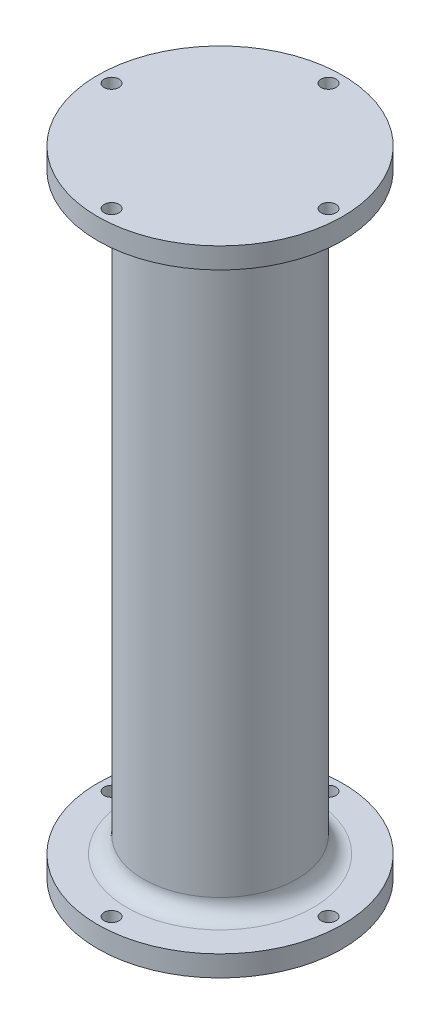
ISO-10303-21;
HEADER;
FILE_DESCRIPTION(('STEP AP214'),'2;1');
FILE_NAME('part.step','',(''),(''),'','','');
FILE_SCHEMA(('AUTOMOTIVE_DESIGN { 1 0 10303 214 1 1 1 1 }'));
ENDSEC;
DATA;
#1=APPLICATION_CONTEXT('core data for automotive mechanical design processes');
#2=APPLICATION_PROTOCOL_DEFINITION('international standard','automotive_design',2000,#1);
#3=PRODUCT_CONTEXT('',#1,'mechanical');
#4=PRODUCT('Part','Part','',(#3));
#5=PRODUCT_RELATED_PRODUCT_CATEGORY('part','',(#4));
#6=PRODUCT_DEFINITION_FORMATION('','',#4);
#7=PRODUCT_DEFINITION_CONTEXT('part definition',#1,'design');
#8=PRODUCT_DEFINITION('design','',#6,#7);
#9=PRODUCT_DEFINITION_SHAPE('','',#8);
#10=(LENGTH_UNIT() NAMED_UNIT(*) SI_UNIT(.MILLI.,.METRE.));
#11=(NAMED_UNIT(*) PLANE_ANGLE_UNIT() SI_UNIT($,.RADIAN.));
#12=(NAMED_UNIT(*) SI_UNIT($,.STERADIAN.) SOLID_ANGLE_UNIT());
#13=UNCERTAINTY_MEASURE_WITH_UNIT(LENGTH_MEASURE(1.E-05),#10,'distance_accuracy_value','');
#14=(GEOMETRIC_REPRESENTATION_CONTEXT(3) GLOBAL_UNCERTAINTY_ASSIGNED_CONTEXT((#13)) GLOBAL_UNIT_ASSIGNED_CONTEXT((#10,
#11,#12)) REPRESENTATION_CONTEXT('',''));
#15=CARTESIAN_POINT('',(0.,0.,0.));
#16=DIRECTION('',(0.,0.,1.));
#17=DIRECTION('',(1.,0.,0.));
#18=AXIS2_PLACEMENT_3D('',#15,#16,#17);
#19=CARTESIAN_POINT('',(0.,385.699,0.));
#20=DIRECTION('',(0.,-1.,0.));
#21=DIRECTION('',(0.,0.,-1.));
#22=AXIS2_PLACEMENT_3D('',#19,#20,#21);
#23=CYLINDRICAL_SURFACE('',#22,74.5);
#24=CARTESIAN_POINT('',(0.,12.7,0.));
#25=DIRECTION('',(0.,1.,0.));
#26=DIRECTION('',(0.,0.,1.));
#27=AXIS2_PLACEMENT_3D('',#24,#25,#26);
#28=CIRCLE('',#27,74.5);
#29=CARTESIAN_POINT('',(0.,12.7,74.5));
#30=VERTEX_POINT('',#29);
#31=EDGE_CURVE('E74',#30,#30,#28,.T.);
#32=ORIENTED_EDGE('',*,*,#31,.F.);
#33=EDGE_LOOP('',(#32));
#34=FACE_BOUND('',#33,.T.);
#35=CARTESIAN_POINT('',(0.,0.,0.));
#36=DIRECTION('',(0.,1.,0.));
#37=DIRECTION('',(0.,0.,1.));
#38=AXIS2_PLACEMENT_3D('',#35,#36,#37);
#39=CIRCLE('',#38,74.5);
#40=CARTESIAN_POINT('',(0.,0.,74.5));
#41=VERTEX_POINT('',#40);
#42=EDGE_CURVE('E70',#41,#41,#39,.T.);
#43=ORIENTED_EDGE('',*,*,#42,.T.);
#44=EDGE_LOOP('',(#43));
#45=FACE_BOUND('',#44,.T.);
#46=ADVANCED_FACE('F45',(#34,#45),#23,.T.);
#47=CARTESIAN_POINT('',(0.,0.,0.));
#48=DIRECTION('',(0.,1.,0.));
#49=DIRECTION('',(0.,0.,1.));
#50=AXIS2_PLACEMENT_3D('',#47,#48,#49);
#51=PLANE('',#50);
#52=CARTESIAN_POINT('',(66.000122,0.,-2.3043819432437E-13));
#53=DIRECTION('',(0.,-1.,0.));
#54=DIRECTION('',(-1.,0.,0.));
#55=AXIS2_PLACEMENT_3D('',#52,#53,#54);
#56=CIRCLE('',#55,4.499991);
#57=CARTESIAN_POINT('',(61.500131,0.,-2.14726559722908E-13));
#58=VERTEX_POINT('',#57);
#59=EDGE_CURVE('E142',#58,#58,#56,.T.);
#60=ORIENTED_EDGE('',*,*,#59,.F.);
#61=EDGE_LOOP('',(#60));
#62=FACE_BOUND('',#61,.T.);
#63=CARTESIAN_POINT('',(0.,0.,-66.000122));
#64=DIRECTION('',(0.,-1.,0.));
#65=DIRECTION('',(0.,0.,1.));
#66=AXIS2_PLACEMENT_3D('',#63,#64,#65);
#67=CIRCLE('',#66,4.499991);
#68=CARTESIAN_POINT('',(0.,0.,-61.500131));
#69=VERTEX_POINT('',#68);
#70=EDGE_CURVE('E134',#69,#69,#67,.T.);
#71=ORIENTED_EDGE('',*,*,#70,.F.);
#72=EDGE_LOOP('',(#71));
#73=FACE_BOUND('',#72,.T.);
#74=CARTESIAN_POINT('',(-66.000122,0.,6.9131458297311E-13));
#75=DIRECTION('',(0.,-1.,0.));
#76=DIRECTION('',(1.,0.,0.));
#77=AXIS2_PLACEMENT_3D('',#74,#75,#76);
#78=CIRCLE('',#77,4.499991);
#79=CARTESIAN_POINT('',(-61.500131,0.,6.44179679168724E-13));
#80=VERTEX_POINT('',#79);
#81=EDGE_CURVE('E126',#80,#80,#78,.T.);
#82=ORIENTED_EDGE('',*,*,#81,.F.);
#83=EDGE_LOOP('',(#82));
#84=FACE_BOUND('',#83,.T.);
#85=CARTESIAN_POINT('',(0.,0.,66.000122));
#86=DIRECTION('',(0.,-1.,0.));
#87=DIRECTION('',(0.,0.,-1.));
#88=AXIS2_PLACEMENT_3D('',#85,#86,#87);
#89=CIRCLE('',#88,4.499991);
#90=CARTESIAN_POINT('',(0.,0.,61.500131));
#91=VERTEX_POINT('',#90);
#92=EDGE_CURVE('E94',#91,#91,#89,.T.);
#93=ORIENTED_EDGE('',*,*,#92,.F.);
#94=EDGE_LOOP('',(#93));
#95=FACE_BOUND('',#94,.T.);
#96=ORIENTED_EDGE('',*,*,#42,.F.);
#97=EDGE_LOOP('',(#96));
#98=FACE_BOUND('',#97,.T.);
#99=ADVANCED_FACE('F195',(#62,#73,#84,#95,#98),#51,.F.);
#100=CARTESIAN_POINT('',(-74.5,12.7,0.));
#101=DIRECTION('',(0.,-1.,0.));
#102=DIRECTION('',(0.,0.,-1.));
#103=AXIS2_PLACEMENT_3D('',#100,#101,#102);
#104=PLANE('',#103);
#105=CARTESIAN_POINT('',(0.,12.7,0.));
#106=DIRECTION('',(0.,-1.,0.));
#107=DIRECTION('',(0.,0.,-1.));
#108=AXIS2_PLACEMENT_3D('',#105,#106,#107);
#109=CIRCLE('',#108,56.6422122002477);
#110=CARTESIAN_POINT('',(0.,12.7,-56.6422122002477));
#111=VERTEX_POINT('',#110);
#112=EDGE_CURVE('E53',#111,#111,#109,.T.);
#113=ORIENTED_EDGE('',*,*,#112,.T.);
#114=EDGE_LOOP('',(#113));
#115=FACE_BOUND('',#114,.T.);
#116=CARTESIAN_POINT('',(66.000122,12.7,-2.3043819432437E-13));
#117=DIRECTION('',(0.,-1.,0.));
#118=DIRECTION('',(0.,0.,-1.));
#119=AXIS2_PLACEMENT_3D('',#116,#117,#118);
#120=CIRCLE('',#119,4.499991);
#121=CARTESIAN_POINT('',(66.000122,12.7,-4.49999100000023));
#122=VERTEX_POINT('',#121);
#123=EDGE_CURVE('E98',#122,#122,#120,.T.);
#124=ORIENTED_EDGE('',*,*,#123,.T.);
#125=EDGE_LOOP('',(#124));
#126=FACE_BOUND('',#125,.T.);
#127=CARTESIAN_POINT('',(0.,12.7,-66.000122));
#128=DIRECTION('',(0.,-1.,0.));
#129=DIRECTION('',(0.,0.,-1.));
#130=AXIS2_PLACEMENT_3D('',#127,#128,#129);
#131=CIRCLE('',#130,4.499991);
#132=CARTESIAN_POINT('',(0.,12.7,-70.500113));
#133=VERTEX_POINT('',#132);
#134=EDGE_CURVE('E109',#133,#133,#131,.T.);
#135=ORIENTED_EDGE('',*,*,#134,.T.);
#136=EDGE_LOOP('',(#135));
#137=FACE_BOUND('',#136,.T.);
#138=CARTESIAN_POINT('',(-66.000122,12.7,6.9131458297311E-13));
#139=DIRECTION('',(0.,-1.,0.));
#140=DIRECTION('',(0.,0.,-1.));
#141=AXIS2_PLACEMENT_3D('',#138,#139,#140);
#142=CIRCLE('',#141,4.499991);
#143=CARTESIAN_POINT('',(-66.000122,12.7,-4.49999099999931));
#144=VERTEX_POINT('',#143);
#145=EDGE_CURVE('E117',#144,#144,#142,.T.);
#146=ORIENTED_EDGE('',*,*,#145,.T.);
#147=EDGE_LOOP('',(#146));
#148=FACE_BOUND('',#147,.T.);
#149=CARTESIAN_POINT('',(0.,12.7,66.000122));
#150=DIRECTION('',(0.,-1.,0.));
#151=DIRECTION('',(0.,0.,-1.));
#152=AXIS2_PLACEMENT_3D('',#149,#150,#151);
#153=CIRCLE('',#152,4.499991);
#154=CARTESIAN_POINT('',(0.,12.7,61.500131));
#155=VERTEX_POINT('',#154);
#156=EDGE_CURVE('E85',#155,#155,#153,.T.);
#157=ORIENTED_EDGE('',*,*,#156,.T.);
#158=EDGE_LOOP('',(#157));
#159=FACE_BOUND('',#158,.T.);
#160=ORIENTED_EDGE('',*,*,#31,.T.);
#161=EDGE_LOOP('',(#160));
#162=FACE_BOUND('',#161,.T.);
#163=ADVANCED_FACE('F166',(#115,#126,#137,#148,#159,#162),#104,.F.);
#164=CARTESIAN_POINT('',(-74.5,372.999,0.));
#165=DIRECTION('',(0.,1.,0.));
#166=DIRECTION('',(0.,0.,1.));
#167=AXIS2_PLACEMENT_3D('',#164,#165,#166);
#168=PLANE('',#167);
#169=CARTESIAN_POINT('',(0.,372.999,0.));
#170=DIRECTION('',(0.,1.,0.));
#171=DIRECTION('',(0.,0.,1.));
#172=AXIS2_PLACEMENT_3D('',#169,#170,#171);
#173=CIRCLE('',#172,56.6422122002477);
#174=CARTESIAN_POINT('',(0.,372.999,56.6422122002477));
#175=VERTEX_POINT('',#174);
#176=EDGE_CURVE('E10',#175,#175,#173,.T.);
#177=ORIENTED_EDGE('',*,*,#176,.T.);
#178=EDGE_LOOP('',(#177));
#179=FACE_BOUND('',#178,.T.);
#180=CARTESIAN_POINT('',(66.000122,372.999,-2.3043819432437E-13));
#181=DIRECTION('',(0.,1.,0.));
#182=DIRECTION('',(0.,0.,1.));
#183=AXIS2_PLACEMENT_3D('',#180,#181,#182);
#184=CIRCLE('',#183,4.499991);
#185=CARTESIAN_POINT('',(66.000122,372.999,4.49999099999977));
#186=VERTEX_POINT('',#185);
#187=EDGE_CURVE('E105',#186,#186,#184,.T.);
#188=ORIENTED_EDGE('',*,*,#187,.T.);
#189=EDGE_LOOP('',(#188));
#190=FACE_BOUND('',#189,.T.);
#191=CARTESIAN_POINT('',(0.,372.999,-66.000122));
#192=DIRECTION('',(0.,1.,0.));
#193=DIRECTION('',(0.,0.,1.));
#194=AXIS2_PLACEMENT_3D('',#191,#192,#193);
#195=CIRCLE('',#194,4.499991);
#196=CARTESIAN_POINT('',(0.,372.999,-61.500131));
#197=VERTEX_POINT('',#196);
#198=EDGE_CURVE('E113',#197,#197,#195,.T.);
#199=ORIENTED_EDGE('',*,*,#198,.T.);
#200=EDGE_LOOP('',(#199));
#201=FACE_BOUND('',#200,.T.);
#202=CARTESIAN_POINT('',(-66.000122,372.999,6.9131458297311E-13));
#203=DIRECTION('',(0.,1.,0.));
#204=DIRECTION('',(0.,0.,1.));
#205=AXIS2_PLACEMENT_3D('',#202,#203,#204);
#206=CIRCLE('',#205,4.499991);
#207=CARTESIAN_POINT('',(-66.000122,372.999,4.49999100000069));
#208=VERTEX_POINT('',#207);
#209=EDGE_CURVE('E121',#208,#208,#206,.T.);
#210=ORIENTED_EDGE('',*,*,#209,.T.);
#211=EDGE_LOOP('',(#210));
#212=FACE_BOUND('',#211,.T.);
#213=CARTESIAN_POINT('',(0.,372.999,66.000122));
#214=DIRECTION('',(0.,1.,0.));
#215=DIRECTION('',(0.,0.,1.));
#216=AXIS2_PLACEMENT_3D('',#213,#214,#215);
#217=CIRCLE('',#216,4.499991);
#218=CARTESIAN_POINT('',(0.,372.999,70.500113));
#219=VERTEX_POINT('',#218);
#220=EDGE_CURVE('E89',#219,#219,#217,.T.);
#221=ORIENTED_EDGE('',*,*,#220,.T.);
#222=EDGE_LOOP('',(#221));
#223=FACE_BOUND('',#222,.T.);
#224=CARTESIAN_POINT('',(0.,372.999,0.));
#225=DIRECTION('',(0.,1.,0.));
#226=DIRECTION('',(0.,0.,1.));
#227=AXIS2_PLACEMENT_3D('',#224,#225,#226);
#228=CIRCLE('',#227,74.5);
#229=CARTESIAN_POINT('',(0.,372.999,74.5));
#230=VERTEX_POINT('',#229);
#231=EDGE_CURVE('E81',#230,#230,#228,.T.);
#232=ORIENTED_EDGE('',*,*,#231,.F.);
#233=EDGE_LOOP('',(#232));
#234=FACE_BOUND('',#233,.T.);
#235=ADVANCED_FACE('F162',(#179,#190,#201,#212,#223,#234),#168,.F.);
#236=CARTESIAN_POINT('',(0.,385.699,0.));
#237=DIRECTION('',(0.,1.,0.));
#238=DIRECTION('',(0.,0.,1.));
#239=AXIS2_PLACEMENT_3D('',#236,#237,#238);
#240=CYLINDRICAL_SURFACE('',#239,46.6422122002477);
#241=CARTESIAN_POINT('',(0.,22.7,0.));
#242=DIRECTION('',(0.,-1.,0.));
#243=DIRECTION('',(0.,0.,-1.));
#244=AXIS2_PLACEMENT_3D('',#241,#242,#243);
#245=CIRCLE('',#244,46.6422122002477);
#246=CARTESIAN_POINT('',(0.,22.7,-46.6422122002477));
#247=VERTEX_POINT('',#246);
#248=EDGE_CURVE('E58',#247,#247,#245,.F.);
#249=ORIENTED_EDGE('',*,*,#248,.T.);
#250=EDGE_LOOP('',(#249));
#251=FACE_BOUND('',#250,.T.);
#252=CARTESIAN_POINT('',(0.,362.999,0.));
#253=DIRECTION('',(0.,1.,0.));
#254=DIRECTION('',(0.,0.,1.));
#255=AXIS2_PLACEMENT_3D('',#252,#253,#254);
#256=CIRCLE('',#255,46.6422122002477);
#257=CARTESIAN_POINT('',(0.,362.999,46.6422122002477));
#258=VERTEX_POINT('',#257);
#259=EDGE_CURVE('E63',#258,#258,#256,.F.);
#260=ORIENTED_EDGE('',*,*,#259,.T.);
#261=EDGE_LOOP('',(#260));
#262=FACE_BOUND('',#261,.T.);
#263=ADVANCED_FACE('F165',(#251,#262),#240,.T.);
#264=CARTESIAN_POINT('',(0.,385.699,0.));
#265=DIRECTION('',(0.,1.,0.));
#266=DIRECTION('',(0.,0.,1.));
#267=AXIS2_PLACEMENT_3D('',#264,#265,#266);
#268=PLANE('',#267);
#269=CARTESIAN_POINT('',(66.000122,385.699,-2.3043819432437E-13));
#270=DIRECTION('',(0.,-1.,0.));
#271=DIRECTION('',(-1.,0.,0.));
#272=AXIS2_PLACEMENT_3D('',#269,#270,#271);
#273=CIRCLE('',#272,4.499991);
#274=CARTESIAN_POINT('',(61.500131,385.699,-2.14726559722908E-13));
#275=VERTEX_POINT('',#274);
#276=EDGE_CURVE('E125',#275,#275,#273,.T.);
#277=ORIENTED_EDGE('',*,*,#276,.T.);
#278=EDGE_LOOP('',(#277));
#279=FACE_BOUND('',#278,.T.);
#280=CARTESIAN_POINT('',(0.,385.699,-66.000122));
#281=DIRECTION('',(0.,-1.,0.));
#282=DIRECTION('',(0.,0.,1.));
#283=AXIS2_PLACEMENT_3D('',#280,#281,#282);
#284=CIRCLE('',#283,4.499991);
#285=CARTESIAN_POINT('',(0.,385.699,-61.500131));
#286=VERTEX_POINT('',#285);
#287=EDGE_CURVE('E138',#286,#286,#284,.T.);
#288=ORIENTED_EDGE('',*,*,#287,.T.);
#289=EDGE_LOOP('',(#288));
#290=FACE_BOUND('',#289,.T.);
#291=CARTESIAN_POINT('',(-66.000122,385.699,6.9131458297311E-13));
#292=DIRECTION('',(0.,-1.,0.));
#293=DIRECTION('',(1.,0.,0.));
#294=AXIS2_PLACEMENT_3D('',#291,#292,#293);
#295=CIRCLE('',#294,4.499991);
#296=CARTESIAN_POINT('',(-61.500131,385.699,6.44179679168724E-13));
#297=VERTEX_POINT('',#296);
#298=EDGE_CURVE('E130',#297,#297,#295,.T.);
#299=ORIENTED_EDGE('',*,*,#298,.T.);
#300=EDGE_LOOP('',(#299));
#301=FACE_BOUND('',#300,.T.);
#302=CARTESIAN_POINT('',(0.,385.699,66.000122));
#303=DIRECTION('',(0.,-1.,0.));
#304=DIRECTION('',(0.,0.,-1.));
#305=AXIS2_PLACEMENT_3D('',#302,#303,#304);
#306=CIRCLE('',#305,4.499991);
#307=CARTESIAN_POINT('',(0.,385.699,61.500131));
#308=VERTEX_POINT('',#307);
#309=EDGE_CURVE('E93',#308,#308,#306,.T.);
#310=ORIENTED_EDGE('',*,*,#309,.T.);
#311=EDGE_LOOP('',(#310));
#312=FACE_BOUND('',#311,.T.);
#313=CARTESIAN_POINT('',(0.,385.699,0.));
#314=DIRECTION('',(0.,1.,0.));
#315=DIRECTION('',(0.,0.,1.));
#316=AXIS2_PLACEMENT_3D('',#313,#314,#315);
#317=CIRCLE('',#316,74.5);
#318=CARTESIAN_POINT('',(0.,385.699,74.5));
#319=VERTEX_POINT('',#318);
#320=EDGE_CURVE('E69',#319,#319,#317,.T.);
#321=ORIENTED_EDGE('',*,*,#320,.T.);
#322=EDGE_LOOP('',(#321));
#323=FACE_BOUND('',#322,.T.);
#324=ADVANCED_FACE('F150',(#279,#290,#301,#312,#323),#268,.T.);
#325=ORIENTED_EDGE('',*,*,#231,.T.);
#326=EDGE_LOOP('',(#325));
#327=FACE_BOUND('',#326,.T.);
#328=ORIENTED_EDGE('',*,*,#320,.F.);
#329=EDGE_LOOP('',(#328));
#330=FACE_BOUND('',#329,.T.);
#331=ADVANCED_FACE('F176',(#327,#330),#23,.T.);
#332=CARTESIAN_POINT('',(0.,385.699,66.000122));
#333=DIRECTION('',(0.,-1.,0.));
#334=DIRECTION('',(0.,0.,-1.));
#335=AXIS2_PLACEMENT_3D('',#332,#333,#334);
#336=CYLINDRICAL_SURFACE('',#335,4.499991);
#337=ORIENTED_EDGE('',*,*,#309,.F.);
#338=EDGE_LOOP('',(#337));
#339=FACE_BOUND('',#338,.T.);
#340=ORIENTED_EDGE('',*,*,#220,.F.);
#341=EDGE_LOOP('',(#340));
#342=FACE_BOUND('',#341,.T.);
#343=ADVANCED_FACE('F179',(#339,#342),#336,.F.);
#344=ORIENTED_EDGE('',*,*,#92,.T.);
#345=EDGE_LOOP('',(#344));
#346=FACE_BOUND('',#345,.T.);
#347=ORIENTED_EDGE('',*,*,#156,.F.);
#348=EDGE_LOOP('',(#347));
#349=FACE_BOUND('',#348,.T.);
#350=ADVANCED_FACE('F229',(#346,#349),#336,.F.);
#351=CARTESIAN_POINT('',(-66.000122,385.699,6.9131458297311E-13));
#352=DIRECTION('',(0.,-1.,0.));
#353=DIRECTION('',(0.,0.,-1.));
#354=AXIS2_PLACEMENT_3D('',#351,#352,#353);
#355=CYLINDRICAL_SURFACE('',#354,4.499991);
#356=ORIENTED_EDGE('',*,*,#298,.F.);
#357=EDGE_LOOP('',(#356));
#358=FACE_BOUND('',#357,.T.);
#359=ORIENTED_EDGE('',*,*,#209,.F.);
#360=EDGE_LOOP('',(#359));
#361=FACE_BOUND('',#360,.T.);
#362=ADVANCED_FACE('F228',(#358,#361),#355,.F.);
#363=CARTESIAN_POINT('',(0.,385.699,-66.000122));
#364=DIRECTION('',(0.,-1.,0.));
#365=DIRECTION('',(0.,0.,-1.));
#366=AXIS2_PLACEMENT_3D('',#363,#364,#365);
#367=CYLINDRICAL_SURFACE('',#366,4.499991);
#368=ORIENTED_EDGE('',*,*,#287,.F.);
#369=EDGE_LOOP('',(#368));
#370=FACE_BOUND('',#369,.T.);
#371=ORIENTED_EDGE('',*,*,#198,.F.);
#372=EDGE_LOOP('',(#371));
#373=FACE_BOUND('',#372,.T.);
#374=ADVANCED_FACE('F157',(#370,#373),#367,.F.);
#375=CARTESIAN_POINT('',(66.000122,385.699,-2.3043819432437E-13));
#376=DIRECTION('',(0.,-1.,0.));
#377=DIRECTION('',(0.,0.,-1.));
#378=AXIS2_PLACEMENT_3D('',#375,#376,#377);
#379=CYLINDRICAL_SURFACE('',#378,4.499991);
#380=ORIENTED_EDGE('',*,*,#276,.F.);
#381=EDGE_LOOP('',(#380));
#382=FACE_BOUND('',#381,.T.);
#383=ORIENTED_EDGE('',*,*,#187,.F.);
#384=EDGE_LOOP('',(#383));
#385=FACE_BOUND('',#384,.T.);
#386=ADVANCED_FACE('F153',(#382,#385),#379,.F.);
#387=ORIENTED_EDGE('',*,*,#81,.T.);
#388=EDGE_LOOP('',(#387));
#389=FACE_BOUND('',#388,.T.);
#390=ORIENTED_EDGE('',*,*,#145,.F.);
#391=EDGE_LOOP('',(#390));
#392=FACE_BOUND('',#391,.T.);
#393=ADVANCED_FACE('F156',(#389,#392),#355,.F.);
#394=ORIENTED_EDGE('',*,*,#70,.T.);
#395=EDGE_LOOP('',(#394));
#396=FACE_BOUND('',#395,.T.);
#397=ORIENTED_EDGE('',*,*,#134,.F.);
#398=EDGE_LOOP('',(#397));
#399=FACE_BOUND('',#398,.T.);
#400=ADVANCED_FACE('F210',(#396,#399),#367,.F.);
#401=ORIENTED_EDGE('',*,*,#59,.T.);
#402=EDGE_LOOP('',(#401));
#403=FACE_BOUND('',#402,.T.);
#404=ORIENTED_EDGE('',*,*,#123,.F.);
#405=EDGE_LOOP('',(#404));
#406=FACE_BOUND('',#405,.T.);
#407=ADVANCED_FACE('F159',(#403,#406),#379,.F.);
#408=CARTESIAN_POINT('',(0.,22.7,0.));
#409=DIRECTION('',(0.,-1.,0.));
#410=DIRECTION('',(0.,0.,-1.));
#411=AXIS2_PLACEMENT_3D('',#408,#409,#410);
#412=TOROIDAL_SURFACE('',#411,56.6422122002477,10.);
#413=ORIENTED_EDGE('',*,*,#112,.F.);
#414=EDGE_LOOP('',(#413));
#415=FACE_BOUND('',#414,.T.);
#416=ORIENTED_EDGE('',*,*,#248,.F.);
#417=EDGE_LOOP('',(#416));
#418=FACE_BOUND('',#417,.T.);
#419=ADVANCED_FACE('F202',(#415,#418),#412,.F.);
#420=CARTESIAN_POINT('',(0.,362.999,0.));
#421=DIRECTION('',(0.,1.,0.));
#422=DIRECTION('',(0.,0.,1.));
#423=AXIS2_PLACEMENT_3D('',#420,#421,#422);
#424=TOROIDAL_SURFACE('',#423,56.6422122002477,10.);
#425=ORIENTED_EDGE('',*,*,#259,.F.);
#426=EDGE_LOOP('',(#425));
#427=FACE_BOUND('',#426,.T.);
#428=ORIENTED_EDGE('',*,*,#176,.F.);
#429=EDGE_LOOP('',(#428));
#430=FACE_BOUND('',#429,.T.);
#431=ADVANCED_FACE('F47',(#427,#430),#424,.F.);
#432=CLOSED_SHELL('',(#46,#99,#163,#235,#263,#324,#331,#343,#350,#362,#374,#386,#393,#400,#407,
#419,#431));
#433=MANIFOLD_SOLID_BREP('B2',#432);
#434=ADVANCED_BREP_SHAPE_REPRESENTATION('',(#18,#433),#14);
#435=SHAPE_DEFINITION_REPRESENTATION(#9,#434);
ENDSEC;
END-ISO-10303-21;
